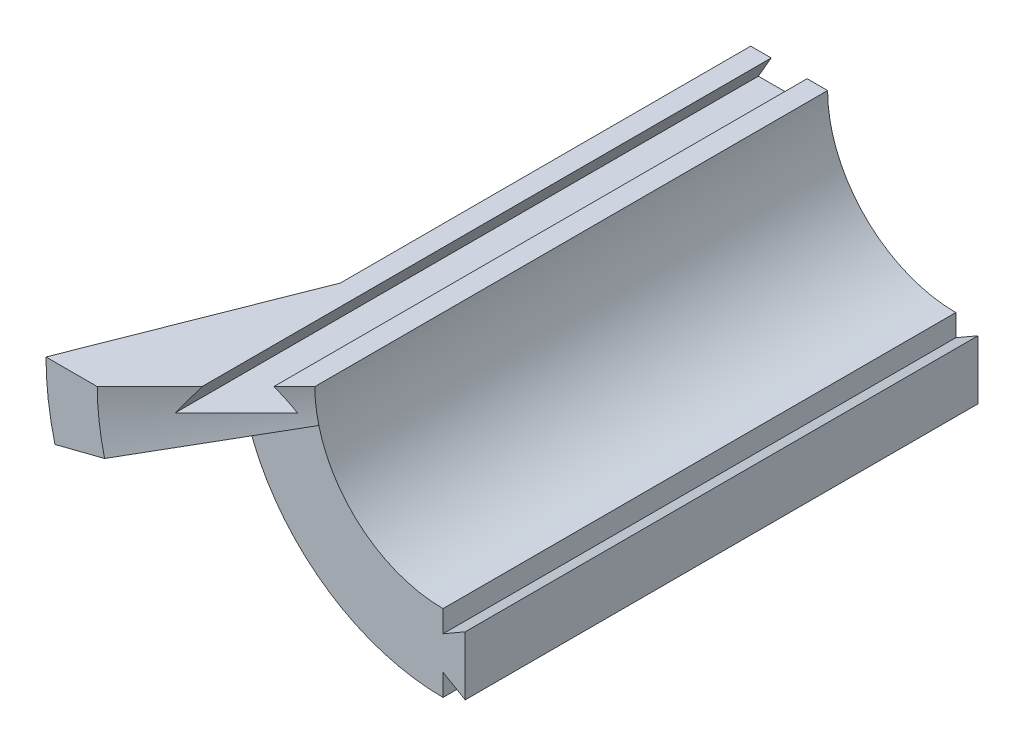
ISO-10303-21;
HEADER;
FILE_DESCRIPTION(('STEP AP214'),'2;1');
FILE_NAME('part.step','',(''),(''),'','','');
FILE_SCHEMA(('AUTOMOTIVE_DESIGN { 1 0 10303 214 1 1 1 1 }'));
ENDSEC;
DATA;
#1=APPLICATION_CONTEXT('core data for automotive mechanical design processes');
#2=APPLICATION_PROTOCOL_DEFINITION('international standard','automotive_design',2000,#1);
#3=PRODUCT_CONTEXT('',#1,'mechanical');
#4=PRODUCT('Part','Part','',(#3));
#5=PRODUCT_RELATED_PRODUCT_CATEGORY('part','',(#4));
#6=PRODUCT_DEFINITION_FORMATION('','',#4);
#7=PRODUCT_DEFINITION_CONTEXT('part definition',#1,'design');
#8=PRODUCT_DEFINITION('design','',#6,#7);
#9=PRODUCT_DEFINITION_SHAPE('','',#8);
#10=(LENGTH_UNIT() NAMED_UNIT(*) SI_UNIT(.MILLI.,.METRE.));
#11=(NAMED_UNIT(*) PLANE_ANGLE_UNIT() SI_UNIT($,.RADIAN.));
#12=(NAMED_UNIT(*) SI_UNIT($,.STERADIAN.) SOLID_ANGLE_UNIT());
#13=UNCERTAINTY_MEASURE_WITH_UNIT(LENGTH_MEASURE(1.E-05),#10,'distance_accuracy_value','');
#14=(GEOMETRIC_REPRESENTATION_CONTEXT(3) GLOBAL_UNCERTAINTY_ASSIGNED_CONTEXT((#13)) GLOBAL_UNIT_ASSIGNED_CONTEXT((#10,
#11,#12)) REPRESENTATION_CONTEXT('',''));
#15=CARTESIAN_POINT('',(0.,0.,0.));
#16=DIRECTION('',(0.,0.,1.));
#17=DIRECTION('',(1.,0.,0.));
#18=AXIS2_PLACEMENT_3D('',#15,#16,#17);
#19=CARTESIAN_POINT('',(0.,-25.,100.));
#20=DIRECTION('',(-1.,0.,0.));
#21=DIRECTION('',(0.,-1.,0.));
#22=AXIS2_PLACEMENT_3D('',#19,#20,#21);
#23=PLANE('',#22);
#24=DIRECTION('',(0.,0.,-1.));
#25=VECTOR('',#24,1.);
#26=CARTESIAN_POINT('',(0.,-35.75,100.));
#27=LINE('',#26,#25);
#28=CARTESIAN_POINT('',(0.,-35.75,100.));
#29=VERTEX_POINT('',#28);
#30=CARTESIAN_POINT('',(0.,-35.75,0.));
#31=VERTEX_POINT('',#30);
#32=EDGE_CURVE('E167',#29,#31,#27,.T.);
#33=ORIENTED_EDGE('',*,*,#32,.F.);
#34=DIRECTION('',(0.,1.,0.));
#35=VECTOR('',#34,1.);
#36=CARTESIAN_POINT('',(0.,-25.,100.));
#37=LINE('',#36,#35);
#38=CARTESIAN_POINT('',(0.,-40.,100.));
#39=VERTEX_POINT('',#38);
#40=EDGE_CURVE('E178',#39,#29,#37,.T.);
#41=ORIENTED_EDGE('',*,*,#40,.F.);
#42=DIRECTION('',(0.,0.,-1.));
#43=VECTOR('',#42,1.);
#44=CARTESIAN_POINT('',(0.,-40.,100.));
#45=LINE('',#44,#43);
#46=CARTESIAN_POINT('',(0.,-40.,0.));
#47=VERTEX_POINT('',#46);
#48=EDGE_CURVE('E264',#39,#47,#45,.T.);
#49=ORIENTED_EDGE('',*,*,#48,.T.);
#50=DIRECTION('',(0.,1.,0.));
#51=VECTOR('',#50,1.);
#52=CARTESIAN_POINT('',(0.,-25.,0.));
#53=LINE('',#52,#51);
#54=EDGE_CURVE('E246',#47,#31,#53,.T.);
#55=ORIENTED_EDGE('',*,*,#54,.T.);
#56=EDGE_LOOP('',(#33,#41,#49,#55));
#57=FACE_BOUND('',#56,.T.);
#58=ADVANCED_FACE('F39',(#57),#23,.F.);
#59=CARTESIAN_POINT('',(-40.,0.,100.));
#60=DIRECTION('',(0.,-1.,0.));
#61=DIRECTION('',(1.,0.,0.));
#62=AXIS2_PLACEMENT_3D('',#59,#60,#61);
#63=PLANE('',#62);
#64=DIRECTION('',(0.707106781186546,0.,-0.707106781186549));
#65=VECTOR('',#64,1.);
#66=CARTESIAN_POINT('',(-25.,0.,100.));
#67=LINE('',#66,#65);
#68=CARTESIAN_POINT('',(-46.2132034355964,0.,121.213203435596));
#69=VERTEX_POINT('',#68);
#70=CARTESIAN_POINT('',(-36.,0.,111.));
#71=VERTEX_POINT('',#70);
#72=EDGE_CURVE('E68',#69,#71,#67,.T.);
#73=ORIENTED_EDGE('',*,*,#72,.T.);
#74=DIRECTION('',(0.,0.,1.));
#75=VECTOR('',#74,1.);
#76=CARTESIAN_POINT('',(-36.,0.,-299.340565272091));
#77=LINE('',#76,#75);
#78=CARTESIAN_POINT('',(-36.,0.,0.));
#79=VERTEX_POINT('',#78);
#80=EDGE_CURVE('E190',#79,#71,#77,.T.);
#81=ORIENTED_EDGE('',*,*,#80,.F.);
#82=DIRECTION('',(-1.,0.,0.));
#83=VECTOR('',#82,1.);
#84=CARTESIAN_POINT('',(-40.,0.,0.));
#85=LINE('',#84,#83);
#86=CARTESIAN_POINT('',(-40.,0.,0.));
#87=VERTEX_POINT('',#86);
#88=EDGE_CURVE('E253',#79,#87,#85,.T.);
#89=ORIENTED_EDGE('',*,*,#88,.T.);
#90=DIRECTION('',(0.,0.,-1.));
#91=VECTOR('',#90,1.);
#92=CARTESIAN_POINT('',(-40.,0.,100.));
#93=LINE('',#92,#91);
#94=CARTESIAN_POINT('',(-40.,0.,80.));
#95=VERTEX_POINT('',#94);
#96=EDGE_CURVE('E267',#95,#87,#93,.T.);
#97=ORIENTED_EDGE('',*,*,#96,.F.);
#98=DIRECTION('',(-0.366088577110094,0.,0.930580009300386));
#99=VECTOR('',#98,1.);
#100=CARTESIAN_POINT('',(-56.2132034355964,0.,121.213203435596));
#101=LINE('',#100,#99);
#102=CARTESIAN_POINT('',(-56.2132034355964,0.,121.213203435596));
#103=VERTEX_POINT('',#102);
#104=EDGE_CURVE('E213',#95,#103,#101,.T.);
#105=ORIENTED_EDGE('',*,*,#104,.T.);
#106=DIRECTION('',(1.,0.,0.));
#107=VECTOR('',#106,1.);
#108=CARTESIAN_POINT('',(-46.2132034355964,0.,121.213203435596));
#109=LINE('',#108,#107);
#110=EDGE_CURVE('E216',#103,#69,#109,.T.);
#111=ORIENTED_EDGE('',*,*,#110,.T.);
#112=EDGE_LOOP('',(#73,#81,#89,#97,#105,#111));
#113=FACE_BOUND('',#112,.T.);
#114=ADVANCED_FACE('F324',(#113),#63,.F.);
#115=CARTESIAN_POINT('',(0.,0.,0.));
#116=DIRECTION('',(0.,0.,-1.));
#117=DIRECTION('',(-1.,0.,0.));
#118=AXIS2_PLACEMENT_3D('',#115,#116,#117);
#119=PLANE('',#118);
#120=DIRECTION('',(1.,0.,0.));
#121=VECTOR('',#120,1.);
#122=CARTESIAN_POINT('',(0.,-4.33012701892214,0.));
#123=LINE('',#122,#121);
#124=CARTESIAN_POINT('',(-38.5,-4.33012701892214,0.));
#125=VERTEX_POINT('',#124);
#126=CARTESIAN_POINT('',(-26.5,-4.33012701892214,0.));
#127=VERTEX_POINT('',#126);
#128=EDGE_CURVE('E207',#125,#127,#123,.T.);
#129=ORIENTED_EDGE('',*,*,#128,.T.);
#130=DIRECTION('',(-0.500000000000004,0.866025403784437,0.));
#131=VECTOR('',#130,1.);
#132=CARTESIAN_POINT('',(-21.7499999999999,-12.5573683548744,0.));
#133=LINE('',#132,#131);
#134=CARTESIAN_POINT('',(-29.,0.,0.));
#135=VERTEX_POINT('',#134);
#136=EDGE_CURVE('E210',#127,#135,#133,.T.);
#137=ORIENTED_EDGE('',*,*,#136,.T.);
#138=CARTESIAN_POINT('',(-25.,0.,0.));
#139=VERTEX_POINT('',#138);
#140=EDGE_CURVE('E254',#139,#135,#85,.T.);
#141=ORIENTED_EDGE('',*,*,#140,.F.);
#142=CARTESIAN_POINT('',(0.,0.,0.));
#143=DIRECTION('',(0.,0.,-1.));
#144=DIRECTION('',(-1.,0.,0.));
#145=AXIS2_PLACEMENT_3D('',#142,#143,#144);
#146=CIRCLE('',#145,25.);
#147=CARTESIAN_POINT('',(0.,-25.,0.));
#148=VERTEX_POINT('',#147);
#149=EDGE_CURVE('E241',#148,#139,#146,.T.);
#150=ORIENTED_EDGE('',*,*,#149,.F.);
#151=CARTESIAN_POINT('',(0.,-29.25,0.));
#152=VERTEX_POINT('',#151);
#153=EDGE_CURVE('E259',#152,#148,#53,.T.);
#154=ORIENTED_EDGE('',*,*,#153,.F.);
#155=DIRECTION('',(0.866025403784436,0.500000000000004,0.));
#156=VECTOR('',#155,1.);
#157=CARTESIAN_POINT('',(12.6656215303475,-21.9374999999999,0.));
#158=LINE('',#157,#156);
#159=CARTESIAN_POINT('',(4.33012701892214,-26.75,0.));
#160=VERTEX_POINT('',#159);
#161=EDGE_CURVE('E60',#152,#160,#158,.T.);
#162=ORIENTED_EDGE('',*,*,#161,.T.);
#163=DIRECTION('',(0.,-1.,0.));
#164=VECTOR('',#163,1.);
#165=CARTESIAN_POINT('',(4.33012701892279,-1.04835431781451E-13,0.));
#166=LINE('',#165,#164);
#167=CARTESIAN_POINT('',(4.33012701892187,-38.2500000000005,0.));
#168=VERTEX_POINT('',#167);
#169=EDGE_CURVE('E186',#160,#168,#166,.T.);
#170=ORIENTED_EDGE('',*,*,#169,.T.);
#171=DIRECTION('',(-0.866025403784381,0.5000000000001,0.));
#172=VECTOR('',#171,1.);
#173=CARTESIAN_POINT('',(-15.4802040926489,-26.8124999999964,0.));
#174=LINE('',#173,#172);
#175=EDGE_CURVE('E162',#168,#31,#174,.T.);
#176=ORIENTED_EDGE('',*,*,#175,.T.);
#177=ORIENTED_EDGE('',*,*,#54,.F.);
#178=CARTESIAN_POINT('',(0.,0.,0.));
#179=DIRECTION('',(0.,0.,1.));
#180=DIRECTION('',(1.,0.,0.));
#181=AXIS2_PLACEMENT_3D('',#178,#179,#180);
#182=CIRCLE('',#181,40.);
#183=EDGE_CURVE('E257',#87,#47,#182,.T.);
#184=ORIENTED_EDGE('',*,*,#183,.F.);
#185=ORIENTED_EDGE('',*,*,#88,.F.);
#186=DIRECTION('',(-0.500000000000005,-0.866025403784436,0.));
#187=VECTOR('',#186,1.);
#188=CARTESIAN_POINT('',(-26.9999999999998,15.58845726812,0.));
#189=LINE('',#188,#187);
#190=EDGE_CURVE('E204',#79,#125,#189,.T.);
#191=ORIENTED_EDGE('',*,*,#190,.T.);
#192=EDGE_LOOP('',(#129,#137,#141,#150,#154,#162,#170,#176,#177,#184,#185,#191));
#193=FACE_BOUND('',#192,.T.);
#194=ADVANCED_FACE('F330',(#193),#119,.T.);
#195=CARTESIAN_POINT('',(0.,0.,121.213203435596));
#196=DIRECTION('',(0.,0.,1.));
#197=DIRECTION('',(1.,0.,0.));
#198=AXIS2_PLACEMENT_3D('',#195,#196,#197);
#199=CONICAL_SURFACE('',#198,46.2132034355964,0.785398163397447);
#200=CARTESIAN_POINT('',(-29.,0.,104.));
#201=VERTEX_POINT('',#200);
#202=CARTESIAN_POINT('',(-25.,0.,100.));
#203=VERTEX_POINT('',#202);
#204=EDGE_CURVE('E218',#201,#203,#67,.T.);
#205=ORIENTED_EDGE('',*,*,#204,.F.);
#206=CARTESIAN_POINT('',(-29.0004041451885,0.0007,104.000404153637));
#207=CARTESIAN_POINT('',(-28.7495130395438,-0.433856142143727,103.749546623706));
#208=CARTESIAN_POINT('',(-28.4966439681946,-0.871838221383273,103.506391512244));
#209=CARTESIAN_POINT('',(-27.9866326901383,-1.75520366740988,103.037944103996));
#210=CARTESIAN_POINT('',(-27.7294880850773,-2.20059118826777,102.812662272241));
#211=CARTESIAN_POINT('',(-27.2092754242329,-3.10162594759077,102.381370343163));
#212=CARTESIAN_POINT('',(-26.946180352022,-3.55731997988114,102.175489817379));
#213=CARTESIAN_POINT('',(-26.4156473905858,-4.4762300241786,101.787669705455));
#214=CARTESIAN_POINT('',(-26.148210308839,-4.93944463759204,101.605725723878));
#215=CARTESIAN_POINT('',(-25.6168481571984,-5.85979088145259,101.273802867802));
#216=CARTESIAN_POINT('',(-25.353043971975,-6.31671313350891,101.123053934983));
#217=CARTESIAN_POINT('',(-24.8217713493521,-7.23690430856204,100.850137599378));
#218=CARTESIAN_POINT('',(-24.554303350761,-7.70017247152058,100.727966804982));
#219=CARTESIAN_POINT('',(-24.0169779275908,-8.6308474046498,100.51529200061));
#220=CARTESIAN_POINT('',(-23.7471289470822,-9.09823954926138,100.424703035235));
#221=CARTESIAN_POINT('',(-23.2051993291115,-10.036889181713,100.277114307881));
#222=CARTESIAN_POINT('',(-22.9331195843651,-10.5081451233242,100.220101716423));
#223=CARTESIAN_POINT('',(-22.5848338750358,-11.1113936674326,100.169723093818));
#224=CARTESIAN_POINT('',(-22.5091645581539,-11.2424567688462,100.16013602385));
#225=CARTESIAN_POINT('',(-22.3577470263928,-11.504719627013,100.143678832692));
#226=CARTESIAN_POINT('',(-22.2819988086995,-11.6359193886406,100.136808811992));
#227=CARTESIAN_POINT('',(-22.1301525907097,-11.8989247531361,100.125782449218));
#228=CARTESIAN_POINT('',(-22.0540543949889,-12.0307306944889,100.121636981598));
#229=CARTESIAN_POINT('',(-21.9018361866242,-12.2943803652137,100.11611122521));
#230=CARTESIAN_POINT('',(-21.8257161750568,-12.4262240927212,100.114730817774));
#231=CARTESIAN_POINT('',(-21.7495958548115,-12.5580683548744,100.114736722756));
#232=B_SPLINE_CURVE_WITH_KNOTS('',3,(#206,#207,#208,#209,#210,#211,#212,#213,#214,#215,#216,
#217,#218,#219,#220,#221,#222,#223,#224,#225,#226,#227,#228,#229,#230,#231),.UNSPECIFIED.,.F.,
.F.,(4,2,2,2,2,2,2,2,2,2,2,2,4),(0.,1.68305721884352,3.36709272577325,5.06167808707506,
6.75595183829026,8.40140094105031,10.046654665136,11.6874478600136,13.3276137030167,
13.782525930333,14.2374549809478,14.6941889286561,15.1509032742643),.UNSPECIFIED.);
#233=CARTESIAN_POINT('',(-26.5,-4.33012701892214,101.851443164195));
#234=VERTEX_POINT('',#233);
#235=EDGE_CURVE('E11',#201,#234,#232,.T.);
#236=ORIENTED_EDGE('',*,*,#235,.T.);
#237=CARTESIAN_POINT('',(-2.12768478609211,-4.33012701892214,79.8246287472682));
#238=CARTESIAN_POINT('',(-2.21418508316704,-4.33012701892214,79.8627816382083));
#239=CARTESIAN_POINT('',(-2.29998329589616,-4.33012701892214,79.9024863918008));
#240=CARTESIAN_POINT('',(-2.47023716924526,-4.33012701892214,79.9846265988582));
#241=CARTESIAN_POINT('',(-2.55469317285213,-4.33012701892214,80.0270613402436));
#242=CARTESIAN_POINT('',(-2.806006543643,-4.33012701892214,80.1578280381396));
#243=CARTESIAN_POINT('',(-2.97101570111545,-4.33012701892214,80.2497154382912));
#244=CARTESIAN_POINT('',(-3.29616784827227,-4.33012701892214,80.4403542206365));
#245=CARTESIAN_POINT('',(-3.45632626420235,-4.33012701892214,80.5390796063004));
#246=CARTESIAN_POINT('',(-3.77313251961413,-4.33012701892214,80.7421027020275));
#247=CARTESIAN_POINT('',(-3.92977913773946,-4.33012701892214,80.8464023093292));
#248=CARTESIAN_POINT('',(-4.2394159961002,-4.33012701892214,81.0588800825099));
#249=CARTESIAN_POINT('',(-4.39241905466836,-4.33012701892214,81.1670396579983));
#250=CARTESIAN_POINT('',(-4.69594907489481,-4.33012701892214,81.386781881982));
#251=CARTESIAN_POINT('',(-4.84647593180832,-4.33012701892214,81.4983646747122));
#252=CARTESIAN_POINT('',(-5.1456092627255,-4.33012701892214,81.7244098648151));
#253=CARTESIAN_POINT('',(-5.2942134189349,-4.33012701892214,81.8388753218908));
#254=CARTESIAN_POINT('',(-5.58965605647691,-4.33012701892214,82.0700647799086));
#255=CARTESIAN_POINT('',(-5.73649449584547,-4.33012701892214,82.1867888343571));
#256=CARTESIAN_POINT('',(-6.16987632743582,-4.33012701892214,82.5357969204767));
#257=CARTESIAN_POINT('',(-6.45428094477287,-4.33012701892214,82.7707362346024));
#258=CARTESIAN_POINT('',(-7.01884691926937,-4.33012701892214,83.2456670583154));
#259=CARTESIAN_POINT('',(-7.29900799710565,-4.33012701892214,83.4856588980123));
#260=CARTESIAN_POINT('',(-7.85615724257083,-4.33012701892214,83.9693986339948));
#261=CARTESIAN_POINT('',(-8.13314479037711,-4.33012701892214,84.2131472429268));
#262=CARTESIAN_POINT('',(-8.68462950335772,-4.33012701892214,84.7034468530987));
#263=CARTESIAN_POINT('',(-8.95912663735486,-4.33012701892214,84.949997889335));
#264=CARTESIAN_POINT('',(-9.50617361503424,-4.33012701892214,85.4452788533628));
#265=CARTESIAN_POINT('',(-9.77872334969264,-4.33012701892214,85.6940089014361));
#266=CARTESIAN_POINT('',(-10.3222503168037,-4.33012701892214,86.1931823834567));
#267=CARTESIAN_POINT('',(-10.5932275406515,-4.33012701892214,86.4436258267634));
#268=CARTESIAN_POINT('',(-11.404191404531,-4.33012701892214,87.1969362153312));
#269=CARTESIAN_POINT('',(-11.9422795705865,-4.33012701892214,87.7018463338394));
#270=CARTESIAN_POINT('',(-13.0202125295482,-4.33012701892214,88.7202280253339));
#271=CARTESIAN_POINT('',(-13.5600236681701,-4.33012701892214,89.2337351281964));
#272=CARTESIAN_POINT('',(-14.6371487616131,-4.33012701892214,90.2633924104512));
#273=CARTESIAN_POINT('',(-15.1744626405469,-4.33012701892214,90.7795426691755));
#274=CARTESIAN_POINT('',(-16.247111570032,-4.33012701892214,91.8136364616083));
#275=CARTESIAN_POINT('',(-16.7824470647318,-4.33012701892214,92.3315795349883));
#276=CARTESIAN_POINT('',(-17.8517085845116,-4.33012701892214,93.3689069817754));
#277=CARTESIAN_POINT('',(-18.3856346238883,-4.33012701892214,93.8882913404524));
#278=CARTESIAN_POINT('',(-19.8565429242847,-4.33012701892214,95.3221125908648));
#279=CARTESIAN_POINT('',(-20.7923977235776,-4.33012701892214,96.2377058380205));
#280=CARTESIAN_POINT('',(-22.6618896318556,-4.33012701892214,98.0711543320195));
#281=CARTESIAN_POINT('',(-23.5955267375041,-4.33012701892214,98.9890095822619));
#282=CARTESIAN_POINT('',(-25.461243003037,-4.33012701892214,100.82631594382));
#283=CARTESIAN_POINT('',(-26.3933221510057,-4.33012701892214,101.745767067233));
#284=CARTESIAN_POINT('',(-28.2563373542268,-4.33012701892214,103.585826837496));
#285=CARTESIAN_POINT('',(-29.1872734091577,-4.33012701892214,104.50643548467));
#286=CARTESIAN_POINT('',(-31.9790343651311,-4.33012701892214,107.269765015933));
#287=CARTESIAN_POINT('',(-33.8385887822888,-4.33012701892214,109.113769299781));
#288=CARTESIAN_POINT('',(-37.5556611027931,-4.33012701892214,112.803814896616));
#289=CARTESIAN_POINT('',(-39.4131790133681,-4.33012701892214,114.649856202326));
#290=CARTESIAN_POINT('',(-43.0720246063666,-4.33012701892214,118.288728189669));
#291=CARTESIAN_POINT('',(-44.8733911866584,-4.33012701892215,120.081519763286));
#292=CARTESIAN_POINT('',(-48.4752522746793,-4.33012701892215,123.667982827778));
#293=CARTESIAN_POINT('',(-50.2757467813827,-4.33012701892215,125.461654319683));
#294=CARTESIAN_POINT('',(-53.8758554083997,-4.33012701892215,129.049379732829));
#295=CARTESIAN_POINT('',(-55.675469616352,-4.33012701892215,130.843433566134));
#296=CARTESIAN_POINT('',(-59.2742159214877,-4.33012701892215,134.432020044971));
#297=CARTESIAN_POINT('',(-61.0733480192946,-4.33012701892215,136.226552689876));
#298=CARTESIAN_POINT('',(-62.8723152139079,-4.33012701892215,138.021250545804));
#299=B_SPLINE_CURVE_WITH_KNOTS('',3,(#237,#238,#239,#240,#241,#242,#243,#244,#245,#246,#247,
#248,#249,#250,#251,#252,#253,#254,#255,#256,#257,#258,#259,#260,#261,#262,#263,#264,#265,#266,
#267,#268,#269,#270,#271,#272,#273,#274,#275,#276,#277,#278,#279,#280,#281,#282,#283,#284,#285,
#286,#287,#288,#289,#290,#291,#292,#293,#294,#295,#296,#297,#298),.UNSPECIFIED.,.F.,.F.,(4,2,2,
2,2,2,2,2,2,2,2,2,2,2,2,2,2,2,2,2,2,2,2,2,2,2,2,2,2,2,4),(0.,0.283581791784141,
0.567089912759206,1.13342806884655,1.69772023433645,2.26220570049767,2.82426576005613,
3.38634953426206,3.9490573972428,4.5117786072192,5.61836423853072,6.72502239500699,
7.83189312970421,8.93877770211992,10.04572376467,11.1526758787273,13.3662988471438,
15.6014104846116,17.8365896048262,20.0712320496139,22.3058517396237,26.2335946772586,
30.1613435208293,34.0891222688228,38.0169021210625,45.8734025779966,53.7298750577881,
61.3542571015007,68.9786480916123,76.6019782387301,84.2252984787),.UNSPECIFIED.);
#300=CARTESIAN_POINT('',(-38.5,-4.33012701892214,113.742741255621));
#301=VERTEX_POINT('',#300);
#302=EDGE_CURVE('E53',#234,#301,#299,.T.);
#303=ORIENTED_EDGE('',*,*,#302,.T.);
#304=CARTESIAN_POINT('',(-38.5001154700539,-4.33032701892214,113.742878355877));
#305=CARTESIAN_POINT('',(-38.2956980611978,-3.97626568083185,113.500179355519));
#306=CARTESIAN_POINT('',(-38.0903611260226,-3.62061167643799,113.260556690888));
#307=CARTESIAN_POINT('',(-37.6778067521333,-2.90604653997698,112.788194325902));
#308=CARTESIAN_POINT('',(-37.4705899433015,-2.54713649889798,112.555452423817));
#309=CARTESIAN_POINT('',(-37.0540944441166,-1.82574513318587,112.097415416688));
#310=CARTESIAN_POINT('',(-36.8448156768383,-1.46326367531454,111.872120590846));
#311=CARTESIAN_POINT('',(-36.4240308568181,-0.734442987985779,111.429678753259));
#312=CARTESIAN_POINT('',(-36.2125241050244,-0.368102547735334,111.2125344026));
#313=CARTESIAN_POINT('',(-35.9998845299462,0.000200000000008331,110.999884530502));
#314=B_SPLINE_CURVE_WITH_KNOTS('',3,(#304,#305,#306,#307,#308,#309,#310,#311,#312,#313),
.UNSPECIFIED.,.F.,.F.,(4,2,2,2,4),(0.,1.42633976266942,2.85221806869555,4.27814977266681,
5.70454305614983),.UNSPECIFIED.);
#315=EDGE_CURVE('E276',#301,#71,#314,.T.);
#316=ORIENTED_EDGE('',*,*,#315,.T.);
#317=ORIENTED_EDGE('',*,*,#72,.F.);
#318=CARTESIAN_POINT('',(0.,0.,121.213203435596));
#319=DIRECTION('',(0.,0.,-1.));
#320=DIRECTION('',(-1.,0.,0.));
#321=AXIS2_PLACEMENT_3D('',#318,#319,#320);
#322=CIRCLE('',#321,46.2132034355964);
#323=CARTESIAN_POINT('',(-44.7773339471362,-11.4302465575535,121.213203435596));
#324=VERTEX_POINT('',#323);
#325=EDGE_CURVE('E232',#324,#69,#322,.T.);
#326=ORIENTED_EDGE('',*,*,#325,.F.);
#327=DIRECTION('',(0.685136587027554,0.174893845278309,-0.707106781186549));
#328=VECTOR('',#327,1.);
#329=CARTESIAN_POINT('',(-24.2232363363096,-6.18343119920419,100.));
#330=LINE('',#329,#328);
#331=CARTESIAN_POINT('',(-24.2232363363096,-6.18343119920418,100.));
#332=VERTEX_POINT('',#331);
#333=EDGE_CURVE('E226',#324,#332,#330,.T.);
#334=ORIENTED_EDGE('',*,*,#333,.T.);
#335=CARTESIAN_POINT('',(0.,0.,100.));
#336=DIRECTION('',(0.,0.,-1.));
#337=DIRECTION('',(-1.,0.,0.));
#338=AXIS2_PLACEMENT_3D('',#335,#336,#337);
#339=CIRCLE('',#338,25.);
#340=EDGE_CURVE('E229',#332,#203,#339,.T.);
#341=ORIENTED_EDGE('',*,*,#340,.T.);
#342=EDGE_LOOP('',(#205,#236,#303,#316,#317,#326,#334,#341));
#343=FACE_BOUND('',#342,.T.);
#344=ADVANCED_FACE('F288',(#343),#199,.F.);
#345=CARTESIAN_POINT('',(0.,0.,100.));
#346=DIRECTION('',(0.,0.,-1.));
#347=DIRECTION('',(-1.,0.,0.));
#348=AXIS2_PLACEMENT_3D('',#345,#346,#347);
#349=PLANE('',#348);
#350=DIRECTION('',(0.968929453452383,0.247337247968167,0.));
#351=VECTOR('',#350,1.);
#352=CARTESIAN_POINT('',(0.,0.,100.));
#353=LINE('',#352,#351);
#354=CARTESIAN_POINT('',(-38.7571781380953,-9.89348991872669,100.));
#355=VERTEX_POINT('',#354);
#356=EDGE_CURVE('E273',#355,#332,#353,.T.);
#357=ORIENTED_EDGE('',*,*,#356,.F.);
#358=CARTESIAN_POINT('',(0.,0.,100.));
#359=DIRECTION('',(0.,0.,1.));
#360=DIRECTION('',(1.,0.,0.));
#361=AXIS2_PLACEMENT_3D('',#358,#359,#360);
#362=CIRCLE('',#361,40.);
#363=EDGE_CURVE('E245',#355,#39,#362,.T.);
#364=ORIENTED_EDGE('',*,*,#363,.T.);
#365=ORIENTED_EDGE('',*,*,#40,.T.);
#366=DIRECTION('',(-0.866025403784381,0.5000000000001,0.));
#367=VECTOR('',#366,1.);
#368=CARTESIAN_POINT('',(-15.4802040926489,-26.8124999999964,100.));
#369=LINE('',#368,#367);
#370=CARTESIAN_POINT('',(4.33012701892187,-38.2500000000005,100.));
#371=VERTEX_POINT('',#370);
#372=EDGE_CURVE('E159',#371,#29,#369,.T.);
#373=ORIENTED_EDGE('',*,*,#372,.F.);
#374=DIRECTION('',(0.,-1.,0.));
#375=VECTOR('',#374,1.);
#376=CARTESIAN_POINT('',(4.33012701892279,-1.04835431781451E-13,100.));
#377=LINE('',#376,#375);
#378=CARTESIAN_POINT('',(4.33012701892214,-26.75,100.));
#379=VERTEX_POINT('',#378);
#380=EDGE_CURVE('E175',#379,#371,#377,.T.);
#381=ORIENTED_EDGE('',*,*,#380,.F.);
#382=DIRECTION('',(0.866025403784436,0.500000000000004,0.));
#383=VECTOR('',#382,1.);
#384=CARTESIAN_POINT('',(12.6656215303475,-21.9374999999999,100.));
#385=LINE('',#384,#383);
#386=CARTESIAN_POINT('',(0.,-29.25,100.));
#387=VERTEX_POINT('',#386);
#388=EDGE_CURVE('E168',#387,#379,#385,.T.);
#389=ORIENTED_EDGE('',*,*,#388,.F.);
#390=CARTESIAN_POINT('',(0.,-25.,100.));
#391=VERTEX_POINT('',#390);
#392=EDGE_CURVE('E248',#387,#391,#37,.T.);
#393=ORIENTED_EDGE('',*,*,#392,.T.);
#394=CARTESIAN_POINT('',(0.,0.,100.));
#395=DIRECTION('',(0.,0.,-1.));
#396=DIRECTION('',(-1.,0.,0.));
#397=AXIS2_PLACEMENT_3D('',#394,#395,#396);
#398=CIRCLE('',#397,25.);
#399=EDGE_CURVE('E242',#391,#332,#398,.T.);
#400=ORIENTED_EDGE('',*,*,#399,.T.);
#401=EDGE_LOOP('',(#357,#364,#365,#373,#381,#389,#393,#400));
#402=FACE_BOUND('',#401,.T.);
#403=ADVANCED_FACE('F173',(#402),#349,.F.);
#404=CARTESIAN_POINT('',(0.,0.,100.));
#405=DIRECTION('',(0.,0.,-1.));
#406=DIRECTION('',(-1.,0.,0.));
#407=AXIS2_PLACEMENT_3D('',#404,#405,#406);
#408=CYLINDRICAL_SURFACE('',#407,25.);
#409=ORIENTED_EDGE('',*,*,#149,.T.);
#410=DIRECTION('',(0.,0.,-1.));
#411=VECTOR('',#410,1.);
#412=CARTESIAN_POINT('',(-25.,0.,100.));
#413=LINE('',#412,#411);
#414=EDGE_CURVE('E270',#203,#139,#413,.T.);
#415=ORIENTED_EDGE('',*,*,#414,.F.);
#416=ORIENTED_EDGE('',*,*,#340,.F.);
#417=ORIENTED_EDGE('',*,*,#399,.F.);
#418=DIRECTION('',(0.,0.,-1.));
#419=VECTOR('',#418,1.);
#420=CARTESIAN_POINT('',(0.,-25.,100.));
#421=LINE('',#420,#419);
#422=EDGE_CURVE('E250',#391,#148,#421,.T.);
#423=ORIENTED_EDGE('',*,*,#422,.T.);
#424=EDGE_LOOP('',(#409,#415,#416,#417,#423));
#425=FACE_BOUND('',#424,.T.);
#426=ADVANCED_FACE('F41',(#425),#408,.F.);
#427=ORIENTED_EDGE('',*,*,#140,.T.);
#428=DIRECTION('',(0.,0.,1.));
#429=VECTOR('',#428,1.);
#430=CARTESIAN_POINT('',(-29.,0.,-299.340565272091));
#431=LINE('',#430,#429);
#432=EDGE_CURVE('E201',#135,#201,#431,.T.);
#433=ORIENTED_EDGE('',*,*,#432,.T.);
#434=ORIENTED_EDGE('',*,*,#204,.T.);
#435=ORIENTED_EDGE('',*,*,#414,.T.);
#436=EDGE_LOOP('',(#427,#433,#434,#435));
#437=FACE_BOUND('',#436,.T.);
#438=ADVANCED_FACE('F331',(#437),#63,.F.);
#439=CARTESIAN_POINT('',(0.,0.,100.));
#440=DIRECTION('',(0.,0.,-1.));
#441=DIRECTION('',(-1.,0.,0.));
#442=AXIS2_PLACEMENT_3D('',#439,#440,#441);
#443=CYLINDRICAL_SURFACE('',#442,40.);
#444=DIRECTION('',(0.,0.,-1.));
#445=VECTOR('',#444,1.);
#446=CARTESIAN_POINT('',(-38.7571781380953,-9.89348991872669,100.));
#447=LINE('',#446,#445);
#448=CARTESIAN_POINT('',(-38.7571781380953,-9.89348991872669,80.));
#449=VERTEX_POINT('',#448);
#450=EDGE_CURVE('E238',#449,#355,#447,.F.);
#451=ORIENTED_EDGE('',*,*,#450,.F.);
#452=CARTESIAN_POINT('',(0.,0.,80.));
#453=DIRECTION('',(0.,0.,-1.));
#454=DIRECTION('',(-1.,0.,0.));
#455=AXIS2_PLACEMENT_3D('',#452,#453,#454);
#456=CIRCLE('',#455,40.);
#457=EDGE_CURVE('E236',#449,#95,#456,.T.);
#458=ORIENTED_EDGE('',*,*,#457,.T.);
#459=ORIENTED_EDGE('',*,*,#96,.T.);
#460=ORIENTED_EDGE('',*,*,#183,.T.);
#461=ORIENTED_EDGE('',*,*,#48,.F.);
#462=ORIENTED_EDGE('',*,*,#363,.F.);
#463=EDGE_LOOP('',(#451,#458,#459,#460,#461,#462));
#464=FACE_BOUND('',#463,.T.);
#465=ADVANCED_FACE('F319',(#464),#443,.T.);
#466=ORIENTED_EDGE('',*,*,#392,.F.);
#467=DIRECTION('',(0.,0.,-1.));
#468=VECTOR('',#467,1.);
#469=CARTESIAN_POINT('',(0.,-29.25,100.));
#470=LINE('',#469,#468);
#471=EDGE_CURVE('E191',#387,#152,#470,.T.);
#472=ORIENTED_EDGE('',*,*,#471,.T.);
#473=ORIENTED_EDGE('',*,*,#153,.T.);
#474=ORIENTED_EDGE('',*,*,#422,.F.);
#475=EDGE_LOOP('',(#466,#472,#473,#474));
#476=FACE_BOUND('',#475,.T.);
#477=ADVANCED_FACE('F310',(#476),#23,.F.);
#478=CARTESIAN_POINT('',(0.,0.,0.));
#479=DIRECTION('',(-0.247337247968167,0.968929453452383,0.));
#480=DIRECTION('',(-0.968929453452383,-0.247337247968167,0.));
#481=AXIS2_PLACEMENT_3D('',#478,#479,#480);
#482=PLANE('',#481);
#483=DIRECTION('',(-0.354714004934444,-0.0905473411749928,0.930580009300386));
#484=VECTOR('',#483,1.);
#485=CARTESIAN_POINT('',(-54.46662848166,-13.9036190372351,121.213203435596));
#486=LINE('',#485,#484);
#487=CARTESIAN_POINT('',(-54.46662848166,-13.9036190372351,121.213203435596));
#488=VERTEX_POINT('',#487);
#489=EDGE_CURVE('E220',#449,#488,#486,.T.);
#490=ORIENTED_EDGE('',*,*,#489,.F.);
#491=ORIENTED_EDGE('',*,*,#450,.T.);
#492=ORIENTED_EDGE('',*,*,#356,.T.);
#493=ORIENTED_EDGE('',*,*,#333,.F.);
#494=DIRECTION('',(0.968929453452383,0.247337247968167,0.));
#495=VECTOR('',#494,1.);
#496=CARTESIAN_POINT('',(-44.7773339471362,-11.4302465575535,121.213203435596));
#497=LINE('',#496,#495);
#498=EDGE_CURVE('E223',#488,#324,#497,.T.);
#499=ORIENTED_EDGE('',*,*,#498,.F.);
#500=EDGE_LOOP('',(#490,#491,#492,#493,#499));
#501=FACE_BOUND('',#500,.T.);
#502=ADVANCED_FACE('F307',(#501),#482,.F.);
#503=CARTESIAN_POINT('',(0.,0.,80.));
#504=DIRECTION('',(0.,0.,1.));
#505=DIRECTION('',(1.,0.,0.));
#506=AXIS2_PLACEMENT_3D('',#503,#504,#505);
#507=CONICAL_SURFACE('',#506,40.,0.374802317771319);
#508=CARTESIAN_POINT('',(0.,0.,121.213203435596));
#509=DIRECTION('',(0.,0.,-1.));
#510=DIRECTION('',(-1.,0.,0.));
#511=AXIS2_PLACEMENT_3D('',#508,#509,#510);
#512=CIRCLE('',#511,56.2132034355964);
#513=EDGE_CURVE('E234',#488,#103,#512,.T.);
#514=ORIENTED_EDGE('',*,*,#513,.T.);
#515=ORIENTED_EDGE('',*,*,#104,.F.);
#516=ORIENTED_EDGE('',*,*,#457,.F.);
#517=ORIENTED_EDGE('',*,*,#489,.T.);
#518=EDGE_LOOP('',(#514,#515,#516,#517));
#519=FACE_BOUND('',#518,.T.);
#520=ADVANCED_FACE('F309',(#519),#507,.T.);
#521=CARTESIAN_POINT('',(-44.7773339471362,-11.4302465575535,121.213203435596));
#522=DIRECTION('',(0.,0.,1.));
#523=DIRECTION('',(1.,0.,0.));
#524=AXIS2_PLACEMENT_3D('',#521,#522,#523);
#525=PLANE('',#524);
#526=ORIENTED_EDGE('',*,*,#325,.T.);
#527=ORIENTED_EDGE('',*,*,#110,.F.);
#528=ORIENTED_EDGE('',*,*,#513,.F.);
#529=ORIENTED_EDGE('',*,*,#498,.T.);
#530=EDGE_LOOP('',(#526,#527,#528,#529));
#531=FACE_BOUND('',#530,.T.);
#532=ADVANCED_FACE('F305',(#531),#525,.T.);
#533=CARTESIAN_POINT('',(-29.,0.,-299.340565272091));
#534=DIRECTION('',(-0.866025403784437,-0.500000000000004,0.));
#535=DIRECTION('',(0.500000000000004,-0.866025403784437,0.));
#536=AXIS2_PLACEMENT_3D('',#533,#534,#535);
#537=PLANE('',#536);
#538=ORIENTED_EDGE('',*,*,#136,.F.);
#539=DIRECTION('',(0.,0.,1.));
#540=VECTOR('',#539,1.);
#541=CARTESIAN_POINT('',(-26.5,-4.33012701892214,-299.340565272091));
#542=LINE('',#541,#540);
#543=EDGE_CURVE('E198',#127,#234,#542,.T.);
#544=ORIENTED_EDGE('',*,*,#543,.T.);
#545=ORIENTED_EDGE('',*,*,#235,.F.);
#546=ORIENTED_EDGE('',*,*,#432,.F.);
#547=EDGE_LOOP('',(#538,#544,#545,#546));
#548=FACE_BOUND('',#547,.T.);
#549=ADVANCED_FACE('F301',(#548),#537,.T.);
#550=CARTESIAN_POINT('',(-26.5,-4.33012701892214,-299.340565272091));
#551=DIRECTION('',(0.,1.,0.));
#552=DIRECTION('',(-1.,0.,0.));
#553=AXIS2_PLACEMENT_3D('',#550,#551,#552);
#554=PLANE('',#553);
#555=ORIENTED_EDGE('',*,*,#128,.F.);
#556=DIRECTION('',(0.,0.,1.));
#557=VECTOR('',#556,1.);
#558=CARTESIAN_POINT('',(-38.5,-4.33012701892214,-299.340565272091));
#559=LINE('',#558,#557);
#560=EDGE_CURVE('E195',#125,#301,#559,.T.);
#561=ORIENTED_EDGE('',*,*,#560,.T.);
#562=ORIENTED_EDGE('',*,*,#302,.F.);
#563=ORIENTED_EDGE('',*,*,#543,.F.);
#564=EDGE_LOOP('',(#555,#561,#562,#563));
#565=FACE_BOUND('',#564,.T.);
#566=ADVANCED_FACE('F296',(#565),#554,.T.);
#567=CARTESIAN_POINT('',(-38.5,-4.33012701892214,-299.340565272091));
#568=DIRECTION('',(0.866025403784436,-0.500000000000005,0.));
#569=DIRECTION('',(0.500000000000005,0.866025403784436,0.));
#570=AXIS2_PLACEMENT_3D('',#567,#568,#569);
#571=PLANE('',#570);
#572=ORIENTED_EDGE('',*,*,#190,.F.);
#573=ORIENTED_EDGE('',*,*,#80,.T.);
#574=ORIENTED_EDGE('',*,*,#315,.F.);
#575=ORIENTED_EDGE('',*,*,#560,.F.);
#576=EDGE_LOOP('',(#572,#573,#574,#575));
#577=FACE_BOUND('',#576,.T.);
#578=ADVANCED_FACE('F292',(#577),#571,.T.);
#579=CARTESIAN_POINT('',(4.33012701892279,-1.04835431781451E-13,100.));
#580=DIRECTION('',(1.,0.,0.));
#581=DIRECTION('',(0.,1.,0.));
#582=AXIS2_PLACEMENT_3D('',#579,#580,#581);
#583=PLANE('',#582);
#584=ORIENTED_EDGE('',*,*,#169,.F.);
#585=DIRECTION('',(0.,0.,-1.));
#586=VECTOR('',#585,1.);
#587=CARTESIAN_POINT('',(4.33012701892214,-26.75,100.));
#588=LINE('',#587,#586);
#589=EDGE_CURVE('E181',#379,#160,#588,.T.);
#590=ORIENTED_EDGE('',*,*,#589,.F.);
#591=ORIENTED_EDGE('',*,*,#380,.T.);
#592=DIRECTION('',(0.,0.,-1.));
#593=VECTOR('',#592,1.);
#594=CARTESIAN_POINT('',(4.33012701892187,-38.2500000000005,100.));
#595=LINE('',#594,#593);
#596=EDGE_CURVE('E156',#371,#168,#595,.T.);
#597=ORIENTED_EDGE('',*,*,#596,.T.);
#598=EDGE_LOOP('',(#584,#590,#591,#597));
#599=FACE_BOUND('',#598,.T.);
#600=ADVANCED_FACE('F180',(#599),#583,.T.);
#601=CARTESIAN_POINT('',(12.6656215303475,-21.9374999999999,100.));
#602=DIRECTION('',(-0.500000000000004,0.866025403784436,0.));
#603=DIRECTION('',(-0.866025403784437,-0.500000000000004,0.));
#604=AXIS2_PLACEMENT_3D('',#601,#602,#603);
#605=PLANE('',#604);
#606=ORIENTED_EDGE('',*,*,#161,.F.);
#607=ORIENTED_EDGE('',*,*,#471,.F.);
#608=ORIENTED_EDGE('',*,*,#388,.T.);
#609=ORIENTED_EDGE('',*,*,#589,.T.);
#610=EDGE_LOOP('',(#606,#607,#608,#609));
#611=FACE_BOUND('',#610,.T.);
#612=ADVANCED_FACE('F367',(#611),#605,.T.);
#613=CARTESIAN_POINT('',(-15.4802040926489,-26.8124999999964,100.));
#614=DIRECTION('',(-0.5000000000001,-0.866025403784381,0.));
#615=DIRECTION('',(0.866025403784381,-0.5000000000001,0.));
#616=AXIS2_PLACEMENT_3D('',#613,#614,#615);
#617=PLANE('',#616);
#618=ORIENTED_EDGE('',*,*,#175,.F.);
#619=ORIENTED_EDGE('',*,*,#596,.F.);
#620=ORIENTED_EDGE('',*,*,#372,.T.);
#621=ORIENTED_EDGE('',*,*,#32,.T.);
#622=EDGE_LOOP('',(#618,#619,#620,#621));
#623=FACE_BOUND('',#622,.T.);
#624=ADVANCED_FACE('F158',(#623),#617,.T.);
#625=CLOSED_SHELL('',(#58,#114,#194,#344,#403,#426,#438,#465,#477,#502,#520,#532,#549,#566,#578,
#600,#612,#624));
#626=MANIFOLD_SOLID_BREP('B2',#625);
#627=ADVANCED_BREP_SHAPE_REPRESENTATION('',(#18,#626),#14);
#628=SHAPE_DEFINITION_REPRESENTATION(#9,#627);
ENDSEC;
END-ISO-10303-21;
